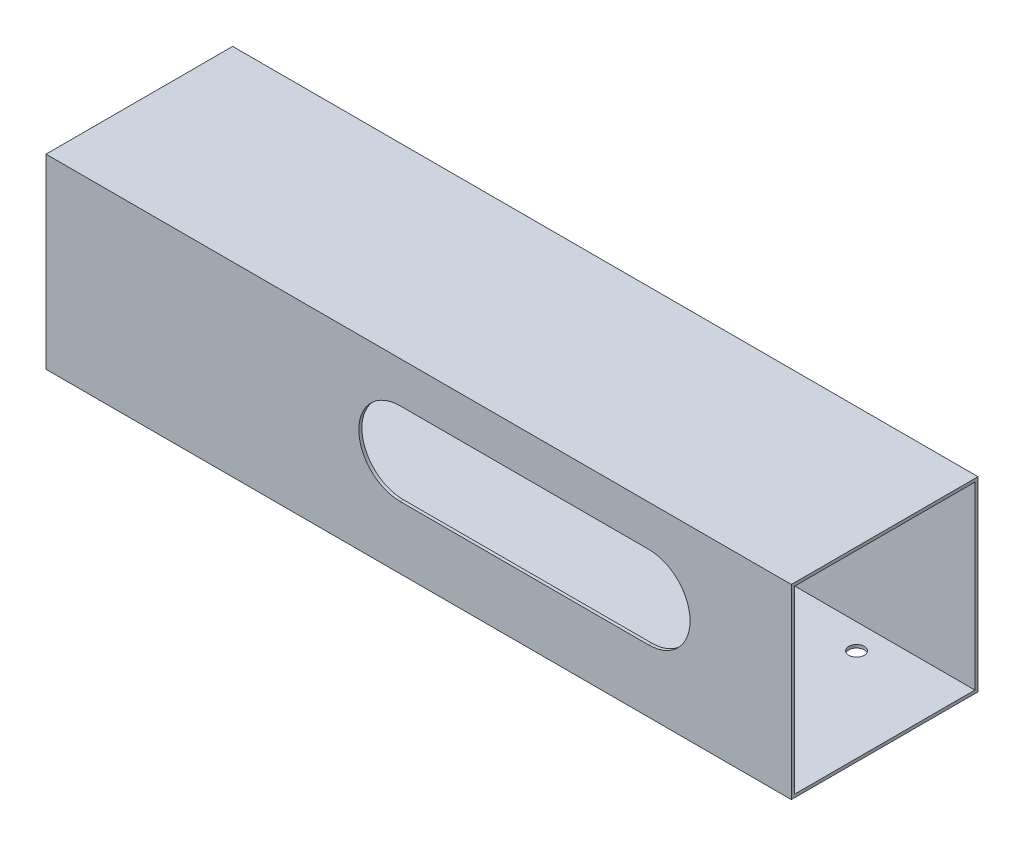
ISO-10303-21;
HEADER;
FILE_DESCRIPTION(('STEP AP214'),'2;1');
FILE_NAME('part.step','',(''),(''),'','','');
FILE_SCHEMA(('AUTOMOTIVE_DESIGN { 1 0 10303 214 1 1 1 1 }'));
ENDSEC;
DATA;
#1=APPLICATION_CONTEXT('core data for automotive mechanical design processes');
#2=APPLICATION_PROTOCOL_DEFINITION('international standard','automotive_design',2000,#1);
#3=PRODUCT_CONTEXT('',#1,'mechanical');
#4=PRODUCT('Part','Part','',(#3));
#5=PRODUCT_RELATED_PRODUCT_CATEGORY('part','',(#4));
#6=PRODUCT_DEFINITION_FORMATION('','',#4);
#7=PRODUCT_DEFINITION_CONTEXT('part definition',#1,'design');
#8=PRODUCT_DEFINITION('design','',#6,#7);
#9=PRODUCT_DEFINITION_SHAPE('','',#8);
#10=(LENGTH_UNIT() NAMED_UNIT(*) SI_UNIT(.MILLI.,.METRE.));
#11=(NAMED_UNIT(*) PLANE_ANGLE_UNIT() SI_UNIT($,.RADIAN.));
#12=(NAMED_UNIT(*) SI_UNIT($,.STERADIAN.) SOLID_ANGLE_UNIT());
#13=UNCERTAINTY_MEASURE_WITH_UNIT(LENGTH_MEASURE(1.E-05),#10,'distance_accuracy_value','');
#14=(GEOMETRIC_REPRESENTATION_CONTEXT(3) GLOBAL_UNCERTAINTY_ASSIGNED_CONTEXT((#13)) GLOBAL_UNIT_ASSIGNED_CONTEXT((#10,
#11,#12)) REPRESENTATION_CONTEXT('',''));
#15=CARTESIAN_POINT('',(0.,0.,0.));
#16=DIRECTION('',(0.,0.,1.));
#17=DIRECTION('',(1.,0.,0.));
#18=AXIS2_PLACEMENT_3D('',#15,#16,#17);
#19=CARTESIAN_POINT('',(240.,0.,0.));
#20=DIRECTION('',(1.,0.,0.));
#21=DIRECTION('',(0.,0.,-1.));
#22=AXIS2_PLACEMENT_3D('',#19,#20,#21);
#23=PLANE('',#22);
#24=DIRECTION('',(0.,-1.,0.));
#25=VECTOR('',#24,1.);
#26=CARTESIAN_POINT('',(240.,41.0924369747897,30.));
#27=LINE('',#26,#25);
#28=CARTESIAN_POINT('',(240.,41.0924369747897,30.));
#29=VERTEX_POINT('',#28);
#30=CARTESIAN_POINT('',(240.,-18.9075630252103,30.));
#31=VERTEX_POINT('',#30);
#32=EDGE_CURVE('E212',#29,#31,#27,.T.);
#33=ORIENTED_EDGE('',*,*,#32,.T.);
#34=DIRECTION('',(0.,0.,-1.));
#35=VECTOR('',#34,1.);
#36=CARTESIAN_POINT('',(240.,-18.9075630252103,30.));
#37=LINE('',#36,#35);
#38=CARTESIAN_POINT('',(240.,-18.9075630252103,-30.1));
#39=VERTEX_POINT('',#38);
#40=EDGE_CURVE('E215',#31,#39,#37,.T.);
#41=ORIENTED_EDGE('',*,*,#40,.T.);
#42=DIRECTION('',(0.,1.,0.));
#43=VECTOR('',#42,1.);
#44=CARTESIAN_POINT('',(240.,41.0924369747897,-30.1));
#45=LINE('',#44,#43);
#46=CARTESIAN_POINT('',(240.,41.0924369747897,-30.1));
#47=VERTEX_POINT('',#46);
#48=EDGE_CURVE('E218',#39,#47,#45,.T.);
#49=ORIENTED_EDGE('',*,*,#48,.T.);
#50=DIRECTION('',(0.,0.,1.));
#51=VECTOR('',#50,1.);
#52=CARTESIAN_POINT('',(240.,41.0924369747897,30.));
#53=LINE('',#52,#51);
#54=EDGE_CURVE('E220',#47,#29,#53,.T.);
#55=ORIENTED_EDGE('',*,*,#54,.T.);
#56=EDGE_LOOP('',(#33,#41,#49,#55));
#57=FACE_BOUND('',#56,.T.);
#58=DIRECTION('',(0.,-1.,0.));
#59=VECTOR('',#58,1.);
#60=CARTESIAN_POINT('',(240.,40.0924369747897,29.));
#61=LINE('',#60,#59);
#62=CARTESIAN_POINT('',(240.,40.0924369747897,29.));
#63=VERTEX_POINT('',#62);
#64=CARTESIAN_POINT('',(240.,-17.9075630252103,29.));
#65=VERTEX_POINT('',#64);
#66=EDGE_CURVE('E181',#63,#65,#61,.T.);
#67=ORIENTED_EDGE('',*,*,#66,.F.);
#68=DIRECTION('',(0.,0.,1.));
#69=VECTOR('',#68,1.);
#70=CARTESIAN_POINT('',(240.,40.0924369747897,29.));
#71=LINE('',#70,#69);
#72=CARTESIAN_POINT('',(240.,40.0924369747897,-29.1));
#73=VERTEX_POINT('',#72);
#74=EDGE_CURVE('E179',#73,#63,#71,.T.);
#75=ORIENTED_EDGE('',*,*,#74,.F.);
#76=DIRECTION('',(0.,1.,0.));
#77=VECTOR('',#76,1.);
#78=CARTESIAN_POINT('',(240.,40.0924369747897,-29.1));
#79=LINE('',#78,#77);
#80=CARTESIAN_POINT('',(240.,-17.9075630252103,-29.1));
#81=VERTEX_POINT('',#80);
#82=EDGE_CURVE('E187',#81,#73,#79,.T.);
#83=ORIENTED_EDGE('',*,*,#82,.F.);
#84=DIRECTION('',(0.,0.,-1.));
#85=VECTOR('',#84,1.);
#86=CARTESIAN_POINT('',(240.,-17.9075630252103,29.));
#87=LINE('',#86,#85);
#88=EDGE_CURVE('E184',#65,#81,#87,.T.);
#89=ORIENTED_EDGE('',*,*,#88,.F.);
#90=EDGE_LOOP('',(#67,#75,#83,#89));
#91=FACE_BOUND('',#90,.T.);
#92=ADVANCED_FACE('F39',(#57,#91),#23,.T.);
#93=CARTESIAN_POINT('',(0.,0.,0.));
#94=DIRECTION('',(1.,0.,0.));
#95=DIRECTION('',(0.,0.,-1.));
#96=AXIS2_PLACEMENT_3D('',#93,#94,#95);
#97=PLANE('',#96);
#98=DIRECTION('',(0.,-1.,0.));
#99=VECTOR('',#98,1.);
#100=CARTESIAN_POINT('',(0.,41.0924369747897,30.));
#101=LINE('',#100,#99);
#102=CARTESIAN_POINT('',(0.,41.0924369747897,30.));
#103=VERTEX_POINT('',#102);
#104=CARTESIAN_POINT('',(0.,-18.9075630252103,30.));
#105=VERTEX_POINT('',#104);
#106=EDGE_CURVE('E211',#103,#105,#101,.T.);
#107=ORIENTED_EDGE('',*,*,#106,.F.);
#108=DIRECTION('',(0.,0.,1.));
#109=VECTOR('',#108,1.);
#110=CARTESIAN_POINT('',(0.,41.0924369747897,30.));
#111=LINE('',#110,#109);
#112=CARTESIAN_POINT('',(0.,41.0924369747897,-30.1));
#113=VERTEX_POINT('',#112);
#114=EDGE_CURVE('E216',#113,#103,#111,.T.);
#115=ORIENTED_EDGE('',*,*,#114,.F.);
#116=DIRECTION('',(0.,1.,0.));
#117=VECTOR('',#116,1.);
#118=CARTESIAN_POINT('',(0.,41.0924369747897,-30.1));
#119=LINE('',#118,#117);
#120=CARTESIAN_POINT('',(0.,-18.9075630252103,-30.1));
#121=VERTEX_POINT('',#120);
#122=EDGE_CURVE('E227',#121,#113,#119,.T.);
#123=ORIENTED_EDGE('',*,*,#122,.F.);
#124=DIRECTION('',(0.,0.,-1.));
#125=VECTOR('',#124,1.);
#126=CARTESIAN_POINT('',(0.,-18.9075630252103,30.));
#127=LINE('',#126,#125);
#128=EDGE_CURVE('E225',#105,#121,#127,.T.);
#129=ORIENTED_EDGE('',*,*,#128,.F.);
#130=EDGE_LOOP('',(#107,#115,#123,#129));
#131=FACE_BOUND('',#130,.T.);
#132=DIRECTION('',(0.,0.,1.));
#133=VECTOR('',#132,1.);
#134=CARTESIAN_POINT('',(0.,40.0924369747897,29.));
#135=LINE('',#134,#133);
#136=CARTESIAN_POINT('',(0.,40.0924369747897,-29.1));
#137=VERTEX_POINT('',#136);
#138=CARTESIAN_POINT('',(0.,40.0924369747897,29.));
#139=VERTEX_POINT('',#138);
#140=EDGE_CURVE('E190',#137,#139,#135,.T.);
#141=ORIENTED_EDGE('',*,*,#140,.T.);
#142=DIRECTION('',(0.,-1.,0.));
#143=VECTOR('',#142,1.);
#144=CARTESIAN_POINT('',(0.,40.0924369747897,29.));
#145=LINE('',#144,#143);
#146=CARTESIAN_POINT('',(0.,-17.9075630252103,29.));
#147=VERTEX_POINT('',#146);
#148=EDGE_CURVE('E193',#139,#147,#145,.T.);
#149=ORIENTED_EDGE('',*,*,#148,.T.);
#150=DIRECTION('',(0.,0.,-1.));
#151=VECTOR('',#150,1.);
#152=CARTESIAN_POINT('',(0.,-17.9075630252103,29.));
#153=LINE('',#152,#151);
#154=CARTESIAN_POINT('',(0.,-17.9075630252103,-29.1));
#155=VERTEX_POINT('',#154);
#156=EDGE_CURVE('E197',#147,#155,#153,.T.);
#157=ORIENTED_EDGE('',*,*,#156,.T.);
#158=DIRECTION('',(0.,1.,0.));
#159=VECTOR('',#158,1.);
#160=CARTESIAN_POINT('',(0.,40.0924369747897,-29.1));
#161=LINE('',#160,#159);
#162=EDGE_CURVE('E182',#155,#137,#161,.T.);
#163=ORIENTED_EDGE('',*,*,#162,.T.);
#164=EDGE_LOOP('',(#141,#149,#157,#163));
#165=FACE_BOUND('',#164,.T.);
#166=ADVANCED_FACE('F288',(#131,#165),#97,.F.);
#167=CARTESIAN_POINT('',(240.,41.0924369747897,30.));
#168=DIRECTION('',(0.,0.,-1.));
#169=DIRECTION('',(0.,1.,0.));
#170=AXIS2_PLACEMENT_3D('',#167,#168,#169);
#171=PLANE('',#170);
#172=DIRECTION('',(-1.,0.,0.));
#173=VECTOR('',#172,1.);
#174=CARTESIAN_POINT('',(194.05133354087,27.9249260790615,30.));
#175=LINE('',#174,#173);
#176=CARTESIAN_POINT('',(194.05133354087,27.9249260790615,30.));
#177=VERTEX_POINT('',#176);
#178=CARTESIAN_POINT('',(114.05133354087,27.9249260790615,30.));
#179=VERTEX_POINT('',#178);
#180=EDGE_CURVE('E139',#177,#179,#175,.T.);
#181=ORIENTED_EDGE('',*,*,#180,.F.);
#182=CARTESIAN_POINT('',(194.05133354087,14.5924369749212,30.));
#183=DIRECTION('',(0.,0.,1.));
#184=DIRECTION('',(1.,0.,0.));
#185=AXIS2_PLACEMENT_3D('',#182,#183,#184);
#186=CIRCLE('',#185,13.3324891041404);
#187=CARTESIAN_POINT('',(194.05133354087,1.25994787078077,30.));
#188=VERTEX_POINT('',#187);
#189=EDGE_CURVE('E54',#188,#177,#186,.T.);
#190=ORIENTED_EDGE('',*,*,#189,.F.);
#191=DIRECTION('',(1.,0.,0.));
#192=VECTOR('',#191,1.);
#193=CARTESIAN_POINT('',(194.05133354087,1.25994787078077,30.));
#194=LINE('',#193,#192);
#195=CARTESIAN_POINT('',(114.05133354087,1.25994787078077,30.));
#196=VERTEX_POINT('',#195);
#197=EDGE_CURVE('E145',#196,#188,#194,.T.);
#198=ORIENTED_EDGE('',*,*,#197,.F.);
#199=CARTESIAN_POINT('',(114.05133354087,14.5924369749212,30.));
#200=DIRECTION('',(0.,0.,1.));
#201=DIRECTION('',(1.,0.,0.));
#202=AXIS2_PLACEMENT_3D('',#199,#200,#201);
#203=CIRCLE('',#202,13.3324891041404);
#204=EDGE_CURVE('E130',#179,#196,#203,.T.);
#205=ORIENTED_EDGE('',*,*,#204,.F.);
#206=EDGE_LOOP('',(#181,#190,#198,#205));
#207=FACE_BOUND('',#206,.T.);
#208=ORIENTED_EDGE('',*,*,#106,.T.);
#209=DIRECTION('',(-1.,0.,0.));
#210=VECTOR('',#209,1.);
#211=CARTESIAN_POINT('',(240.,-18.9075630252103,30.));
#212=LINE('',#211,#210);
#213=EDGE_CURVE('E238',#31,#105,#212,.T.);
#214=ORIENTED_EDGE('',*,*,#213,.F.);
#215=ORIENTED_EDGE('',*,*,#32,.F.);
#216=DIRECTION('',(-1.,0.,0.));
#217=VECTOR('',#216,1.);
#218=CARTESIAN_POINT('',(240.,41.0924369747897,30.));
#219=LINE('',#218,#217);
#220=EDGE_CURVE('E222',#29,#103,#219,.T.);
#221=ORIENTED_EDGE('',*,*,#220,.T.);
#222=EDGE_LOOP('',(#208,#214,#215,#221));
#223=FACE_BOUND('',#222,.T.);
#224=ADVANCED_FACE('F41',(#207,#223),#171,.F.);
#225=CARTESIAN_POINT('',(240.,-18.9075630252103,30.));
#226=DIRECTION('',(0.,1.,0.));
#227=DIRECTION('',(0.,0.,1.));
#228=AXIS2_PLACEMENT_3D('',#225,#226,#227);
#229=PLANE('',#228);
#230=CARTESIAN_POINT('',(99.,-18.9075630252103,21.));
#231=DIRECTION('',(0.,1.,0.));
#232=DIRECTION('',(0.,0.,1.));
#233=AXIS2_PLACEMENT_3D('',#230,#231,#232);
#234=CIRCLE('',#233,2.5);
#235=CARTESIAN_POINT('',(99.,-18.9075630252103,23.5));
#236=VERTEX_POINT('',#235);
#237=EDGE_CURVE('E158',#236,#236,#234,.T.);
#238=ORIENTED_EDGE('',*,*,#237,.T.);
#239=EDGE_LOOP('',(#238));
#240=FACE_BOUND('',#239,.T.);
#241=CARTESIAN_POINT('',(42.,-18.9075630252103,-15.));
#242=DIRECTION('',(0.,1.,0.));
#243=DIRECTION('',(0.,0.,-1.));
#244=AXIS2_PLACEMENT_3D('',#241,#242,#243);
#245=CIRCLE('',#244,2.);
#246=CARTESIAN_POINT('',(42.,-18.9075630252103,-17.));
#247=VERTEX_POINT('',#246);
#248=EDGE_CURVE('E164',#247,#247,#245,.T.);
#249=ORIENTED_EDGE('',*,*,#248,.T.);
#250=EDGE_LOOP('',(#249));
#251=FACE_BOUND('',#250,.T.);
#252=CARTESIAN_POINT('',(12.,-18.9075630252103,15.));
#253=DIRECTION('',(0.,1.,0.));
#254=DIRECTION('',(0.,0.,-1.));
#255=AXIS2_PLACEMENT_3D('',#252,#253,#254);
#256=CIRCLE('',#255,2.);
#257=CARTESIAN_POINT('',(12.,-18.9075630252103,13.));
#258=VERTEX_POINT('',#257);
#259=EDGE_CURVE('E167',#258,#258,#256,.T.);
#260=ORIENTED_EDGE('',*,*,#259,.T.);
#261=EDGE_LOOP('',(#260));
#262=FACE_BOUND('',#261,.T.);
#263=CARTESIAN_POINT('',(42.,-18.9075630252103,15.));
#264=DIRECTION('',(0.,1.,0.));
#265=DIRECTION('',(0.,0.,1.));
#266=AXIS2_PLACEMENT_3D('',#263,#264,#265);
#267=CIRCLE('',#266,2.);
#268=CARTESIAN_POINT('',(42.,-18.9075630252103,17.));
#269=VERTEX_POINT('',#268);
#270=EDGE_CURVE('E170',#269,#269,#267,.T.);
#271=ORIENTED_EDGE('',*,*,#270,.T.);
#272=EDGE_LOOP('',(#271));
#273=FACE_BOUND('',#272,.T.);
#274=CARTESIAN_POINT('',(210.,-18.9075630252103,21.));
#275=DIRECTION('',(0.,1.,0.));
#276=DIRECTION('',(0.,0.,1.));
#277=AXIS2_PLACEMENT_3D('',#274,#275,#276);
#278=CIRCLE('',#277,2.5);
#279=CARTESIAN_POINT('',(210.,-18.9075630252103,23.5));
#280=VERTEX_POINT('',#279);
#281=EDGE_CURVE('E155',#280,#280,#278,.T.);
#282=ORIENTED_EDGE('',*,*,#281,.T.);
#283=EDGE_LOOP('',(#282));
#284=FACE_BOUND('',#283,.T.);
#285=CARTESIAN_POINT('',(210.,-18.9075630252103,-21.));
#286=DIRECTION('',(0.,1.,0.));
#287=DIRECTION('',(0.,0.,-1.));
#288=AXIS2_PLACEMENT_3D('',#285,#286,#287);
#289=CIRCLE('',#288,2.5);
#290=CARTESIAN_POINT('',(210.,-18.9075630252103,-23.5));
#291=VERTEX_POINT('',#290);
#292=EDGE_CURVE('E159',#291,#291,#289,.T.);
#293=ORIENTED_EDGE('',*,*,#292,.T.);
#294=EDGE_LOOP('',(#293));
#295=FACE_BOUND('',#294,.T.);
#296=CARTESIAN_POINT('',(99.,-18.9075630252103,-21.));
#297=DIRECTION('',(0.,1.,0.));
#298=DIRECTION('',(0.,0.,-1.));
#299=AXIS2_PLACEMENT_3D('',#296,#297,#298);
#300=CIRCLE('',#299,2.5);
#301=CARTESIAN_POINT('',(99.,-18.9075630252103,-23.5));
#302=VERTEX_POINT('',#301);
#303=EDGE_CURVE('E152',#302,#302,#300,.T.);
#304=ORIENTED_EDGE('',*,*,#303,.T.);
#305=EDGE_LOOP('',(#304));
#306=FACE_BOUND('',#305,.T.);
#307=CARTESIAN_POINT('',(12.,-18.9075630252103,-15.));
#308=DIRECTION('',(0.,1.,0.));
#309=DIRECTION('',(0.,0.,1.));
#310=AXIS2_PLACEMENT_3D('',#307,#308,#309);
#311=CIRCLE('',#310,2.);
#312=CARTESIAN_POINT('',(12.,-18.9075630252103,-13.));
#313=VERTEX_POINT('',#312);
#314=EDGE_CURVE('E173',#313,#313,#311,.T.);
#315=ORIENTED_EDGE('',*,*,#314,.T.);
#316=EDGE_LOOP('',(#315));
#317=FACE_BOUND('',#316,.T.);
#318=ORIENTED_EDGE('',*,*,#128,.T.);
#319=DIRECTION('',(-1.,0.,0.));
#320=VECTOR('',#319,1.);
#321=CARTESIAN_POINT('',(240.,-18.9075630252103,-30.1));
#322=LINE('',#321,#320);
#323=EDGE_CURVE('E235',#39,#121,#322,.T.);
#324=ORIENTED_EDGE('',*,*,#323,.F.);
#325=ORIENTED_EDGE('',*,*,#40,.F.);
#326=ORIENTED_EDGE('',*,*,#213,.T.);
#327=EDGE_LOOP('',(#318,#324,#325,#326));
#328=FACE_BOUND('',#327,.T.);
#329=ADVANCED_FACE('F307',(#240,#251,#262,#273,#284,#295,#306,#317,#328),#229,.F.);
#330=CARTESIAN_POINT('',(240.,41.0924369747897,-30.1));
#331=DIRECTION('',(0.,0.,1.));
#332=DIRECTION('',(0.,-1.,0.));
#333=AXIS2_PLACEMENT_3D('',#330,#331,#332);
#334=PLANE('',#333);
#335=ORIENTED_EDGE('',*,*,#122,.T.);
#336=DIRECTION('',(-1.,0.,0.));
#337=VECTOR('',#336,1.);
#338=CARTESIAN_POINT('',(240.,41.0924369747897,-30.1));
#339=LINE('',#338,#337);
#340=EDGE_CURVE('E232',#47,#113,#339,.T.);
#341=ORIENTED_EDGE('',*,*,#340,.F.);
#342=ORIENTED_EDGE('',*,*,#48,.F.);
#343=ORIENTED_EDGE('',*,*,#323,.T.);
#344=EDGE_LOOP('',(#335,#341,#342,#343));
#345=FACE_BOUND('',#344,.T.);
#346=ADVANCED_FACE('F304',(#345),#334,.F.);
#347=CARTESIAN_POINT('',(240.,41.0924369747897,30.));
#348=DIRECTION('',(0.,-1.,0.));
#349=DIRECTION('',(0.,0.,-1.));
#350=AXIS2_PLACEMENT_3D('',#347,#348,#349);
#351=PLANE('',#350);
#352=ORIENTED_EDGE('',*,*,#114,.T.);
#353=ORIENTED_EDGE('',*,*,#220,.F.);
#354=ORIENTED_EDGE('',*,*,#54,.F.);
#355=ORIENTED_EDGE('',*,*,#340,.T.);
#356=EDGE_LOOP('',(#352,#353,#354,#355));
#357=FACE_BOUND('',#356,.T.);
#358=ADVANCED_FACE('F301',(#357),#351,.F.);
#359=CARTESIAN_POINT('',(240.,40.0924369747897,29.));
#360=DIRECTION('',(0.,-1.,0.));
#361=DIRECTION('',(0.,0.,-1.));
#362=AXIS2_PLACEMENT_3D('',#359,#360,#361);
#363=PLANE('',#362);
#364=ORIENTED_EDGE('',*,*,#140,.F.);
#365=DIRECTION('',(-1.,0.,0.));
#366=VECTOR('',#365,1.);
#367=CARTESIAN_POINT('',(240.,40.0924369747897,-29.1));
#368=LINE('',#367,#366);
#369=EDGE_CURVE('E189',#73,#137,#368,.T.);
#370=ORIENTED_EDGE('',*,*,#369,.F.);
#371=ORIENTED_EDGE('',*,*,#74,.T.);
#372=DIRECTION('',(-1.,0.,0.));
#373=VECTOR('',#372,1.);
#374=CARTESIAN_POINT('',(240.,40.0924369747897,29.));
#375=LINE('',#374,#373);
#376=EDGE_CURVE('E208',#63,#139,#375,.T.);
#377=ORIENTED_EDGE('',*,*,#376,.T.);
#378=EDGE_LOOP('',(#364,#370,#371,#377));
#379=FACE_BOUND('',#378,.T.);
#380=ADVANCED_FACE('F298',(#379),#363,.T.);
#381=CARTESIAN_POINT('',(240.,40.0924369747897,29.));
#382=DIRECTION('',(0.,0.,-1.));
#383=DIRECTION('',(-1.,0.,0.));
#384=AXIS2_PLACEMENT_3D('',#381,#382,#383);
#385=PLANE('',#384);
#386=CARTESIAN_POINT('',(194.05133354087,14.5924369749212,29.));
#387=DIRECTION('',(0.,0.,-1.));
#388=DIRECTION('',(-1.,0.,0.));
#389=AXIS2_PLACEMENT_3D('',#386,#387,#388);
#390=CIRCLE('',#389,13.3324891041404);
#391=CARTESIAN_POINT('',(194.05133354087,27.9249260790615,29.));
#392=VERTEX_POINT('',#391);
#393=CARTESIAN_POINT('',(194.05133354087,1.25994787078077,29.));
#394=VERTEX_POINT('',#393);
#395=EDGE_CURVE('E11',#392,#394,#390,.T.);
#396=ORIENTED_EDGE('',*,*,#395,.F.);
#397=DIRECTION('',(1.,0.,0.));
#398=VECTOR('',#397,1.);
#399=CARTESIAN_POINT('',(240.,27.9249260790615,29.));
#400=LINE('',#399,#398);
#401=CARTESIAN_POINT('',(114.05133354087,27.9249260790615,29.));
#402=VERTEX_POINT('',#401);
#403=EDGE_CURVE('E241',#402,#392,#400,.T.);
#404=ORIENTED_EDGE('',*,*,#403,.F.);
#405=CARTESIAN_POINT('',(114.05133354087,14.5924369749212,29.));
#406=DIRECTION('',(0.,0.,-1.));
#407=DIRECTION('',(-1.,0.,0.));
#408=AXIS2_PLACEMENT_3D('',#405,#406,#407);
#409=CIRCLE('',#408,13.3324891041404);
#410=CARTESIAN_POINT('',(114.05133354087,1.25994787078077,29.));
#411=VERTEX_POINT('',#410);
#412=EDGE_CURVE('E133',#411,#402,#409,.T.);
#413=ORIENTED_EDGE('',*,*,#412,.F.);
#414=DIRECTION('',(-1.,0.,0.));
#415=VECTOR('',#414,1.);
#416=CARTESIAN_POINT('',(240.,1.25994787078077,29.));
#417=LINE('',#416,#415);
#418=EDGE_CURVE('E47',#394,#411,#417,.T.);
#419=ORIENTED_EDGE('',*,*,#418,.F.);
#420=EDGE_LOOP('',(#396,#404,#413,#419));
#421=FACE_BOUND('',#420,.T.);
#422=ORIENTED_EDGE('',*,*,#148,.F.);
#423=ORIENTED_EDGE('',*,*,#376,.F.);
#424=ORIENTED_EDGE('',*,*,#66,.T.);
#425=DIRECTION('',(-1.,0.,0.));
#426=VECTOR('',#425,1.);
#427=CARTESIAN_POINT('',(240.,-17.9075630252103,29.));
#428=LINE('',#427,#426);
#429=EDGE_CURVE('E206',#65,#147,#428,.T.);
#430=ORIENTED_EDGE('',*,*,#429,.T.);
#431=EDGE_LOOP('',(#422,#423,#424,#430));
#432=FACE_BOUND('',#431,.T.);
#433=ADVANCED_FACE('F271',(#421,#432),#385,.T.);
#434=CARTESIAN_POINT('',(240.,-17.9075630252103,29.));
#435=DIRECTION('',(0.,1.,0.));
#436=DIRECTION('',(0.,0.,1.));
#437=AXIS2_PLACEMENT_3D('',#434,#435,#436);
#438=PLANE('',#437);
#439=CARTESIAN_POINT('',(99.,-17.9075630252103,21.));
#440=DIRECTION('',(0.,1.,0.));
#441=DIRECTION('',(0.,0.,1.));
#442=AXIS2_PLACEMENT_3D('',#439,#440,#441);
#443=CIRCLE('',#442,2.5);
#444=CARTESIAN_POINT('',(99.,-17.9075630252103,23.5));
#445=VERTEX_POINT('',#444);
#446=EDGE_CURVE('E194',#445,#445,#443,.T.);
#447=ORIENTED_EDGE('',*,*,#446,.F.);
#448=EDGE_LOOP('',(#447));
#449=FACE_BOUND('',#448,.T.);
#450=CARTESIAN_POINT('',(42.,-17.9075630252103,-15.));
#451=DIRECTION('',(0.,1.,0.));
#452=DIRECTION('',(0.,0.,1.));
#453=AXIS2_PLACEMENT_3D('',#450,#451,#452);
#454=CIRCLE('',#453,2.);
#455=CARTESIAN_POINT('',(42.,-17.9075630252103,-13.));
#456=VERTEX_POINT('',#455);
#457=EDGE_CURVE('E259',#456,#456,#454,.T.);
#458=ORIENTED_EDGE('',*,*,#457,.F.);
#459=EDGE_LOOP('',(#458));
#460=FACE_BOUND('',#459,.T.);
#461=CARTESIAN_POINT('',(12.,-17.9075630252103,15.));
#462=DIRECTION('',(0.,1.,0.));
#463=DIRECTION('',(0.,0.,1.));
#464=AXIS2_PLACEMENT_3D('',#461,#462,#463);
#465=CIRCLE('',#464,2.);
#466=CARTESIAN_POINT('',(12.,-17.9075630252103,17.));
#467=VERTEX_POINT('',#466);
#468=EDGE_CURVE('E256',#467,#467,#465,.T.);
#469=ORIENTED_EDGE('',*,*,#468,.F.);
#470=EDGE_LOOP('',(#469));
#471=FACE_BOUND('',#470,.T.);
#472=CARTESIAN_POINT('',(42.,-17.9075630252103,15.));
#473=DIRECTION('',(0.,1.,0.));
#474=DIRECTION('',(0.,0.,1.));
#475=AXIS2_PLACEMENT_3D('',#472,#473,#474);
#476=CIRCLE('',#475,2.);
#477=CARTESIAN_POINT('',(42.,-17.9075630252103,17.));
#478=VERTEX_POINT('',#477);
#479=EDGE_CURVE('E253',#478,#478,#476,.T.);
#480=ORIENTED_EDGE('',*,*,#479,.F.);
#481=EDGE_LOOP('',(#480));
#482=FACE_BOUND('',#481,.T.);
#483=CARTESIAN_POINT('',(210.,-17.9075630252103,21.));
#484=DIRECTION('',(0.,1.,0.));
#485=DIRECTION('',(0.,0.,1.));
#486=AXIS2_PLACEMENT_3D('',#483,#484,#485);
#487=CIRCLE('',#486,2.5);
#488=CARTESIAN_POINT('',(210.,-17.9075630252103,23.5));
#489=VERTEX_POINT('',#488);
#490=EDGE_CURVE('E250',#489,#489,#487,.T.);
#491=ORIENTED_EDGE('',*,*,#490,.F.);
#492=EDGE_LOOP('',(#491));
#493=FACE_BOUND('',#492,.T.);
#494=CARTESIAN_POINT('',(210.,-17.9075630252103,-21.));
#495=DIRECTION('',(0.,1.,0.));
#496=DIRECTION('',(0.,0.,1.));
#497=AXIS2_PLACEMENT_3D('',#494,#495,#496);
#498=CIRCLE('',#497,2.5);
#499=CARTESIAN_POINT('',(210.,-17.9075630252103,-18.5));
#500=VERTEX_POINT('',#499);
#501=EDGE_CURVE('E247',#500,#500,#498,.T.);
#502=ORIENTED_EDGE('',*,*,#501,.F.);
#503=EDGE_LOOP('',(#502));
#504=FACE_BOUND('',#503,.T.);
#505=CARTESIAN_POINT('',(99.,-17.9075630252103,-21.));
#506=DIRECTION('',(0.,1.,0.));
#507=DIRECTION('',(0.,0.,1.));
#508=AXIS2_PLACEMENT_3D('',#505,#506,#507);
#509=CIRCLE('',#508,2.5);
#510=CARTESIAN_POINT('',(99.,-17.9075630252103,-18.5));
#511=VERTEX_POINT('',#510);
#512=EDGE_CURVE('E244',#511,#511,#509,.T.);
#513=ORIENTED_EDGE('',*,*,#512,.F.);
#514=EDGE_LOOP('',(#513));
#515=FACE_BOUND('',#514,.T.);
#516=CARTESIAN_POINT('',(12.,-17.9075630252103,-15.));
#517=DIRECTION('',(0.,1.,0.));
#518=DIRECTION('',(0.,0.,1.));
#519=AXIS2_PLACEMENT_3D('',#516,#517,#518);
#520=CIRCLE('',#519,2.);
#521=CARTESIAN_POINT('',(12.,-17.9075630252103,-13.));
#522=VERTEX_POINT('',#521);
#523=EDGE_CURVE('E178',#522,#522,#520,.T.);
#524=ORIENTED_EDGE('',*,*,#523,.F.);
#525=EDGE_LOOP('',(#524));
#526=FACE_BOUND('',#525,.T.);
#527=ORIENTED_EDGE('',*,*,#156,.F.);
#528=ORIENTED_EDGE('',*,*,#429,.F.);
#529=ORIENTED_EDGE('',*,*,#88,.T.);
#530=DIRECTION('',(-1.,0.,0.));
#531=VECTOR('',#530,1.);
#532=CARTESIAN_POINT('',(240.,-17.9075630252103,-29.1));
#533=LINE('',#532,#531);
#534=EDGE_CURVE('E204',#81,#155,#533,.T.);
#535=ORIENTED_EDGE('',*,*,#534,.T.);
#536=EDGE_LOOP('',(#527,#528,#529,#535));
#537=FACE_BOUND('',#536,.T.);
#538=ADVANCED_FACE('F354',(#449,#460,#471,#482,#493,#504,#515,#526,#537),#438,.T.);
#539=CARTESIAN_POINT('',(240.,40.0924369747897,-29.1));
#540=DIRECTION('',(0.,0.,1.));
#541=DIRECTION('',(1.,0.,0.));
#542=AXIS2_PLACEMENT_3D('',#539,#540,#541);
#543=PLANE('',#542);
#544=ORIENTED_EDGE('',*,*,#162,.F.);
#545=ORIENTED_EDGE('',*,*,#534,.F.);
#546=ORIENTED_EDGE('',*,*,#82,.T.);
#547=ORIENTED_EDGE('',*,*,#369,.T.);
#548=EDGE_LOOP('',(#544,#545,#546,#547));
#549=FACE_BOUND('',#548,.T.);
#550=ADVANCED_FACE('F347',(#549),#543,.T.);
#551=CARTESIAN_POINT('',(12.,-18.9075630252103,-15.));
#552=DIRECTION('',(0.,1.,0.));
#553=DIRECTION('',(0.,0.,1.));
#554=AXIS2_PLACEMENT_3D('',#551,#552,#553);
#555=CYLINDRICAL_SURFACE('',#554,2.);
#556=ORIENTED_EDGE('',*,*,#523,.T.);
#557=EDGE_LOOP('',(#556));
#558=FACE_BOUND('',#557,.T.);
#559=ORIENTED_EDGE('',*,*,#314,.F.);
#560=EDGE_LOOP('',(#559));
#561=FACE_BOUND('',#560,.T.);
#562=ADVANCED_FACE('F362',(#558,#561),#555,.F.);
#563=CARTESIAN_POINT('',(99.,-18.9075630252103,-21.));
#564=DIRECTION('',(0.,1.,0.));
#565=DIRECTION('',(0.,0.,1.));
#566=AXIS2_PLACEMENT_3D('',#563,#564,#565);
#567=CYLINDRICAL_SURFACE('',#566,2.5);
#568=ORIENTED_EDGE('',*,*,#512,.T.);
#569=EDGE_LOOP('',(#568));
#570=FACE_BOUND('',#569,.T.);
#571=ORIENTED_EDGE('',*,*,#303,.F.);
#572=EDGE_LOOP('',(#571));
#573=FACE_BOUND('',#572,.T.);
#574=ADVANCED_FACE('F369',(#570,#573),#567,.F.);
#575=CARTESIAN_POINT('',(210.,-18.9075630252103,-21.));
#576=DIRECTION('',(0.,1.,0.));
#577=DIRECTION('',(0.,0.,1.));
#578=AXIS2_PLACEMENT_3D('',#575,#576,#577);
#579=CYLINDRICAL_SURFACE('',#578,2.5);
#580=ORIENTED_EDGE('',*,*,#501,.T.);
#581=EDGE_LOOP('',(#580));
#582=FACE_BOUND('',#581,.T.);
#583=ORIENTED_EDGE('',*,*,#292,.F.);
#584=EDGE_LOOP('',(#583));
#585=FACE_BOUND('',#584,.T.);
#586=ADVANCED_FACE('F385',(#582,#585),#579,.F.);
#587=CARTESIAN_POINT('',(210.,-18.9075630252103,21.));
#588=DIRECTION('',(0.,1.,0.));
#589=DIRECTION('',(0.,0.,1.));
#590=AXIS2_PLACEMENT_3D('',#587,#588,#589);
#591=CYLINDRICAL_SURFACE('',#590,2.5);
#592=ORIENTED_EDGE('',*,*,#490,.T.);
#593=EDGE_LOOP('',(#592));
#594=FACE_BOUND('',#593,.T.);
#595=ORIENTED_EDGE('',*,*,#281,.F.);
#596=EDGE_LOOP('',(#595));
#597=FACE_BOUND('',#596,.T.);
#598=ADVANCED_FACE('F377',(#594,#597),#591,.F.);
#599=CARTESIAN_POINT('',(42.,-18.9075630252103,15.));
#600=DIRECTION('',(0.,1.,0.));
#601=DIRECTION('',(0.,0.,1.));
#602=AXIS2_PLACEMENT_3D('',#599,#600,#601);
#603=CYLINDRICAL_SURFACE('',#602,2.);
#604=ORIENTED_EDGE('',*,*,#479,.T.);
#605=EDGE_LOOP('',(#604));
#606=FACE_BOUND('',#605,.T.);
#607=ORIENTED_EDGE('',*,*,#270,.F.);
#608=EDGE_LOOP('',(#607));
#609=FACE_BOUND('',#608,.T.);
#610=ADVANCED_FACE('F374',(#606,#609),#603,.F.);
#611=CARTESIAN_POINT('',(12.,-18.9075630252103,15.));
#612=DIRECTION('',(0.,1.,0.));
#613=DIRECTION('',(0.,0.,1.));
#614=AXIS2_PLACEMENT_3D('',#611,#612,#613);
#615=CYLINDRICAL_SURFACE('',#614,2.);
#616=ORIENTED_EDGE('',*,*,#468,.T.);
#617=EDGE_LOOP('',(#616));
#618=FACE_BOUND('',#617,.T.);
#619=ORIENTED_EDGE('',*,*,#259,.F.);
#620=EDGE_LOOP('',(#619));
#621=FACE_BOUND('',#620,.T.);
#622=ADVANCED_FACE('F371',(#618,#621),#615,.F.);
#623=CARTESIAN_POINT('',(42.,-18.9075630252103,-15.));
#624=DIRECTION('',(0.,1.,0.));
#625=DIRECTION('',(0.,0.,1.));
#626=AXIS2_PLACEMENT_3D('',#623,#624,#625);
#627=CYLINDRICAL_SURFACE('',#626,2.);
#628=ORIENTED_EDGE('',*,*,#457,.T.);
#629=EDGE_LOOP('',(#628));
#630=FACE_BOUND('',#629,.T.);
#631=ORIENTED_EDGE('',*,*,#248,.F.);
#632=EDGE_LOOP('',(#631));
#633=FACE_BOUND('',#632,.T.);
#634=ADVANCED_FACE('F282',(#630,#633),#627,.F.);
#635=CARTESIAN_POINT('',(99.,-18.9075630252103,21.));
#636=DIRECTION('',(0.,1.,0.));
#637=DIRECTION('',(0.,0.,1.));
#638=AXIS2_PLACEMENT_3D('',#635,#636,#637);
#639=CYLINDRICAL_SURFACE('',#638,2.5);
#640=ORIENTED_EDGE('',*,*,#446,.T.);
#641=EDGE_LOOP('',(#640));
#642=FACE_BOUND('',#641,.T.);
#643=ORIENTED_EDGE('',*,*,#237,.F.);
#644=EDGE_LOOP('',(#643));
#645=FACE_BOUND('',#644,.T.);
#646=ADVANCED_FACE('F275',(#642,#645),#639,.F.);
#647=CARTESIAN_POINT('',(194.05133354087,14.5924369749212,20.));
#648=DIRECTION('',(0.,0.,1.));
#649=DIRECTION('',(1.,0.,0.));
#650=AXIS2_PLACEMENT_3D('',#647,#648,#649);
#651=CYLINDRICAL_SURFACE('',#650,13.3324891041404);
#652=ORIENTED_EDGE('',*,*,#395,.T.);
#653=DIRECTION('',(0.,0.,1.));
#654=VECTOR('',#653,1.);
#655=CARTESIAN_POINT('',(194.05133354087,1.25994787078077,20.));
#656=LINE('',#655,#654);
#657=EDGE_CURVE('E150',#394,#188,#656,.T.);
#658=ORIENTED_EDGE('',*,*,#657,.T.);
#659=ORIENTED_EDGE('',*,*,#189,.T.);
#660=DIRECTION('',(0.,0.,1.));
#661=VECTOR('',#660,1.);
#662=CARTESIAN_POINT('',(194.05133354087,27.9249260790615,20.));
#663=LINE('',#662,#661);
#664=EDGE_CURVE('E136',#392,#177,#663,.T.);
#665=ORIENTED_EDGE('',*,*,#664,.F.);
#666=EDGE_LOOP('',(#652,#658,#659,#665));
#667=FACE_BOUND('',#666,.T.);
#668=ADVANCED_FACE('F273',(#667),#651,.F.);
#669=CARTESIAN_POINT('',(194.05133354087,1.25994787078077,20.));
#670=DIRECTION('',(0.,-1.,0.));
#671=DIRECTION('',(0.,0.,-1.));
#672=AXIS2_PLACEMENT_3D('',#669,#670,#671);
#673=PLANE('',#672);
#674=ORIENTED_EDGE('',*,*,#418,.T.);
#675=DIRECTION('',(0.,0.,1.));
#676=VECTOR('',#675,1.);
#677=CARTESIAN_POINT('',(114.05133354087,1.25994787078077,20.));
#678=LINE('',#677,#676);
#679=EDGE_CURVE('E135',#411,#196,#678,.T.);
#680=ORIENTED_EDGE('',*,*,#679,.T.);
#681=ORIENTED_EDGE('',*,*,#197,.T.);
#682=ORIENTED_EDGE('',*,*,#657,.F.);
#683=EDGE_LOOP('',(#674,#680,#681,#682));
#684=FACE_BOUND('',#683,.T.);
#685=ADVANCED_FACE('F268',(#684),#673,.F.);
#686=CARTESIAN_POINT('',(114.05133354087,14.5924369749212,20.));
#687=DIRECTION('',(0.,0.,1.));
#688=DIRECTION('',(1.,0.,0.));
#689=AXIS2_PLACEMENT_3D('',#686,#687,#688);
#690=CYLINDRICAL_SURFACE('',#689,13.3324891041404);
#691=ORIENTED_EDGE('',*,*,#412,.T.);
#692=DIRECTION('',(0.,0.,1.));
#693=VECTOR('',#692,1.);
#694=CARTESIAN_POINT('',(114.05133354087,27.9249260790615,20.));
#695=LINE('',#694,#693);
#696=EDGE_CURVE('E62',#402,#179,#695,.T.);
#697=ORIENTED_EDGE('',*,*,#696,.T.);
#698=ORIENTED_EDGE('',*,*,#204,.T.);
#699=ORIENTED_EDGE('',*,*,#679,.F.);
#700=EDGE_LOOP('',(#691,#697,#698,#699));
#701=FACE_BOUND('',#700,.T.);
#702=ADVANCED_FACE('F127',(#701),#690,.F.);
#703=CARTESIAN_POINT('',(194.05133354087,27.9249260790615,20.));
#704=DIRECTION('',(0.,1.,0.));
#705=DIRECTION('',(0.,0.,1.));
#706=AXIS2_PLACEMENT_3D('',#703,#704,#705);
#707=PLANE('',#706);
#708=ORIENTED_EDGE('',*,*,#403,.T.);
#709=ORIENTED_EDGE('',*,*,#664,.T.);
#710=ORIENTED_EDGE('',*,*,#180,.T.);
#711=ORIENTED_EDGE('',*,*,#696,.F.);
#712=EDGE_LOOP('',(#708,#709,#710,#711));
#713=FACE_BOUND('',#712,.T.);
#714=ADVANCED_FACE('F140',(#713),#707,.F.);
#715=CLOSED_SHELL('',(#92,#166,#224,#329,#346,#358,#380,#433,#538,#550,#562,#574,#586,#598,#610,
#622,#634,#646,#668,#685,#702,#714));
#716=MANIFOLD_SOLID_BREP('B2',#715);
#717=ADVANCED_BREP_SHAPE_REPRESENTATION('',(#18,#716),#14);
#718=SHAPE_DEFINITION_REPRESENTATION(#9,#717);
ENDSEC;
END-ISO-10303-21;
